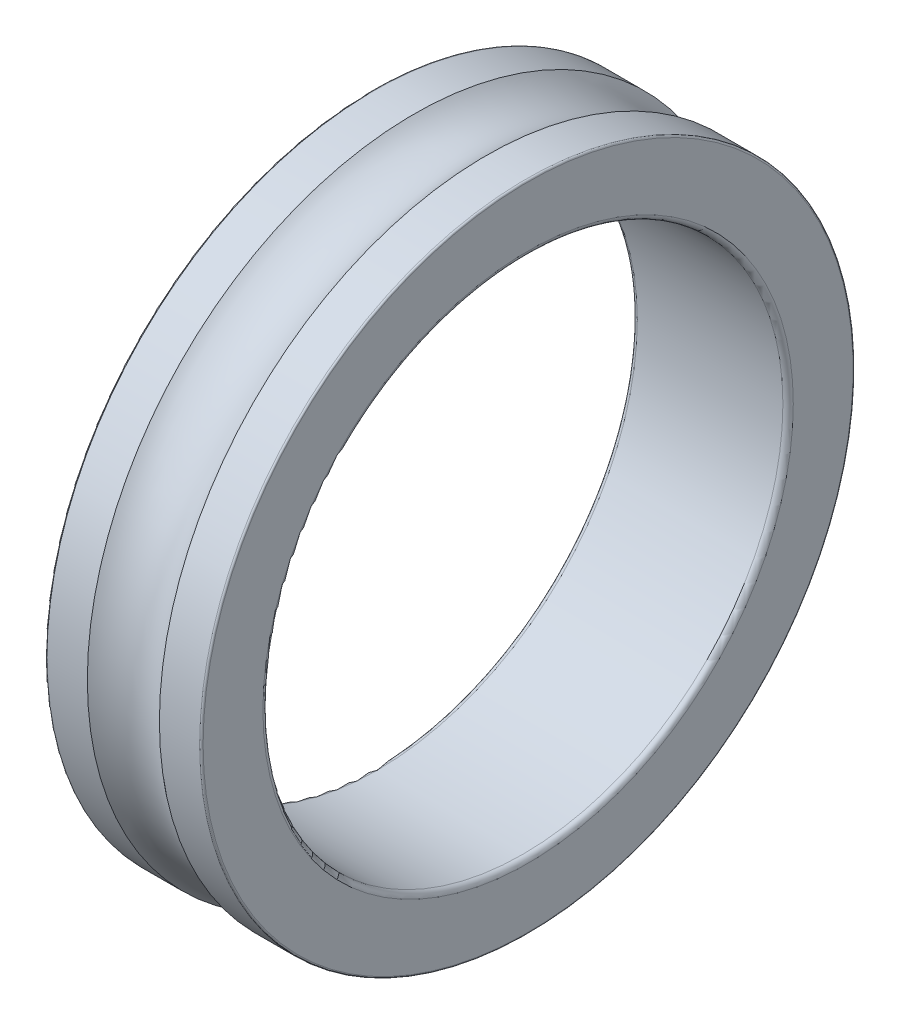
ISO-10303-21;
HEADER;
FILE_DESCRIPTION(('STEP AP214'),'2;1');
FILE_NAME('part.step','',(''),(''),'','','');
FILE_SCHEMA(('AUTOMOTIVE_DESIGN { 1 0 10303 214 1 1 1 1 }'));
ENDSEC;
DATA;
#1=APPLICATION_CONTEXT('core data for automotive mechanical design processes');
#2=APPLICATION_PROTOCOL_DEFINITION('international standard','automotive_design',2000,#1);
#3=PRODUCT_CONTEXT('',#1,'mechanical');
#4=PRODUCT('Part','Part','',(#3));
#5=PRODUCT_RELATED_PRODUCT_CATEGORY('part','',(#4));
#6=PRODUCT_DEFINITION_FORMATION('','',#4);
#7=PRODUCT_DEFINITION_CONTEXT('part definition',#1,'design');
#8=PRODUCT_DEFINITION('design','',#6,#7);
#9=PRODUCT_DEFINITION_SHAPE('','',#8);
#10=(LENGTH_UNIT() NAMED_UNIT(*) SI_UNIT(.MILLI.,.METRE.));
#11=(NAMED_UNIT(*) PLANE_ANGLE_UNIT() SI_UNIT($,.RADIAN.));
#12=(NAMED_UNIT(*) SI_UNIT($,.STERADIAN.) SOLID_ANGLE_UNIT());
#13=UNCERTAINTY_MEASURE_WITH_UNIT(LENGTH_MEASURE(1.E-05),#10,'distance_accuracy_value','');
#14=(GEOMETRIC_REPRESENTATION_CONTEXT(3) GLOBAL_UNCERTAINTY_ASSIGNED_CONTEXT((#13)) GLOBAL_UNIT_ASSIGNED_CONTEXT((#10,
#11,#12)) REPRESENTATION_CONTEXT('',''));
#15=CARTESIAN_POINT('',(0.,0.,0.));
#16=DIRECTION('',(0.,0.,1.));
#17=DIRECTION('',(1.,0.,0.));
#18=AXIS2_PLACEMENT_3D('',#15,#16,#17);
#19=CARTESIAN_POINT('',(0.,-19.0983064341402,-18.75));
#20=DIRECTION('',(-1.,0.,0.));
#21=DIRECTION('',(0.,0.,1.));
#22=AXIS2_PLACEMENT_3D('',#19,#20,#21);
#23=PLANE('',#22);
#24=CARTESIAN_POINT('',(0.,0.,0.));
#25=DIRECTION('',(-1.,0.,0.));
#26=DIRECTION('',(0.,0.,-1.));
#27=AXIS2_PLACEMENT_3D('',#24,#25,#26);
#28=CIRCLE('',#27,18.7500000129054);
#29=CARTESIAN_POINT('',(0.,0.,-18.7500000129054));
#30=VERTEX_POINT('',#29);
#31=EDGE_CURVE('E50',#30,#30,#28,.F.);
#32=ORIENTED_EDGE('',*,*,#31,.F.);
#33=EDGE_LOOP('',(#32));
#34=FACE_BOUND('',#33,.T.);
#35=CARTESIAN_POINT('',(0.,0.,0.));
#36=DIRECTION('',(1.,0.,0.));
#37=DIRECTION('',(0.,-1.16849681709782E-09,1.));
#38=AXIS2_PLACEMENT_3D('',#35,#36,#37);
#39=CIRCLE('',#38,15.3);
#40=CARTESIAN_POINT('',(0.,-1.78780013015967E-08,15.3));
#41=VERTEX_POINT('',#40);
#42=EDGE_CURVE('E47',#41,#41,#39,.T.);
#43=ORIENTED_EDGE('',*,*,#42,.T.);
#44=EDGE_LOOP('',(#43));
#45=FACE_BOUND('',#44,.T.);
#46=ADVANCED_FACE('F15',(#34,#45),#23,.T.);
#47=CARTESIAN_POINT('',(9.,-19.0983064451772,18.75));
#48=DIRECTION('',(1.,0.,0.));
#49=DIRECTION('',(0.,0.,-1.));
#50=AXIS2_PLACEMENT_3D('',#47,#48,#49);
#51=PLANE('',#50);
#52=CARTESIAN_POINT('',(9.,0.,0.));
#53=DIRECTION('',(1.,0.,0.));
#54=DIRECTION('',(0.,0.,1.));
#55=AXIS2_PLACEMENT_3D('',#52,#53,#54);
#56=CIRCLE('',#55,18.7500000165268);
#57=CARTESIAN_POINT('',(9.,0.,18.7500000165268));
#58=VERTEX_POINT('',#57);
#59=EDGE_CURVE('E44',#58,#58,#56,.T.);
#60=ORIENTED_EDGE('',*,*,#59,.T.);
#61=EDGE_LOOP('',(#60));
#62=FACE_BOUND('',#61,.T.);
#63=CARTESIAN_POINT('',(9.,0.,0.));
#64=DIRECTION('',(-1.,0.,0.));
#65=DIRECTION('',(0.,0.,-1.));
#66=AXIS2_PLACEMENT_3D('',#63,#64,#65);
#67=CIRCLE('',#66,15.3000000077429);
#68=CARTESIAN_POINT('',(9.,0.,-15.3000000077429));
#69=VERTEX_POINT('',#68);
#70=EDGE_CURVE('E41',#69,#69,#67,.F.);
#71=ORIENTED_EDGE('',*,*,#70,.F.);
#72=EDGE_LOOP('',(#71));
#73=FACE_BOUND('',#72,.T.);
#74=ADVANCED_FACE('F58',(#62,#73),#51,.T.);
#75=CARTESIAN_POINT('',(0.29999999999994,0.,0.));
#76=DIRECTION('',(1.,0.,0.));
#77=DIRECTION('',(0.,0.,1.));
#78=AXIS2_PLACEMENT_3D('',#75,#76,#77);
#79=TOROIDAL_SURFACE('',#78,15.3,0.29999999999994);
#80=CARTESIAN_POINT('',(0.299999999999994,0.,0.));
#81=DIRECTION('',(1.,0.,0.));
#82=DIRECTION('',(0.,0.,1.));
#83=AXIS2_PLACEMENT_3D('',#80,#81,#82);
#84=CIRCLE('',#83,15.0000000000001);
#85=CARTESIAN_POINT('',(0.299999999999994,0.,15.0000000000001));
#86=VERTEX_POINT('',#85);
#87=EDGE_CURVE('E38',#86,#86,#84,.T.);
#88=ORIENTED_EDGE('',*,*,#87,.T.);
#89=EDGE_LOOP('',(#88));
#90=FACE_BOUND('',#89,.T.);
#91=ORIENTED_EDGE('',*,*,#42,.F.);
#92=EDGE_LOOP('',(#91));
#93=FACE_BOUND('',#92,.T.);
#94=ADVANCED_FACE('F62',(#90,#93),#79,.T.);
#95=CARTESIAN_POINT('',(100.,0.,0.));
#96=DIRECTION('',(1.,0.,0.));
#97=DIRECTION('',(0.,0.,1.));
#98=AXIS2_PLACEMENT_3D('',#95,#96,#97);
#99=CYLINDRICAL_SURFACE('',#98,15.);
#100=CARTESIAN_POINT('',(8.7,0.,0.));
#101=DIRECTION('',(1.,0.,0.));
#102=DIRECTION('',(0.,-1.9234201974874E-10,1.));
#103=AXIS2_PLACEMENT_3D('',#100,#101,#102);
#104=CIRCLE('',#103,15.);
#105=CARTESIAN_POINT('',(8.7,-2.8851302962311E-09,15.));
#106=VERTEX_POINT('',#105);
#107=EDGE_CURVE('E35',#106,#106,#104,.T.);
#108=ORIENTED_EDGE('',*,*,#107,.T.);
#109=EDGE_LOOP('',(#108));
#110=FACE_BOUND('',#109,.T.);
#111=ORIENTED_EDGE('',*,*,#87,.F.);
#112=EDGE_LOOP('',(#111));
#113=FACE_BOUND('',#112,.T.);
#114=ADVANCED_FACE('F64',(#110,#113),#99,.F.);
#115=CARTESIAN_POINT('',(8.70000000000012,0.,0.));
#116=DIRECTION('',(1.,0.,0.));
#117=DIRECTION('',(0.,1.16849786547399E-09,1.));
#118=AXIS2_PLACEMENT_3D('',#115,#116,#117);
#119=TOROIDAL_SURFACE('',#118,15.3,0.29999999999988);
#120=ORIENTED_EDGE('',*,*,#70,.T.);
#121=EDGE_LOOP('',(#120));
#122=FACE_BOUND('',#121,.T.);
#123=ORIENTED_EDGE('',*,*,#107,.F.);
#124=EDGE_LOOP('',(#123));
#125=FACE_BOUND('',#124,.T.);
#126=ADVANCED_FACE('F72',(#122,#125),#119,.T.);
#127=CARTESIAN_POINT('',(8.90000000000066,0.,0.));
#128=DIRECTION('',(1.,0.,0.));
#129=DIRECTION('',(0.,0.,1.));
#130=AXIS2_PLACEMENT_3D('',#127,#128,#129);
#131=TOROIDAL_SURFACE('',#130,18.7500000000007,0.0999999999993402);
#132=CARTESIAN_POINT('',(8.90000000000066,0.,0.));
#133=DIRECTION('',(1.,0.,0.));
#134=DIRECTION('',(0.,0.,1.));
#135=AXIS2_PLACEMENT_3D('',#132,#133,#134);
#136=CIRCLE('',#135,18.85);
#137=CARTESIAN_POINT('',(8.90000000000066,0.,18.85));
#138=VERTEX_POINT('',#137);
#139=EDGE_CURVE('E30',#138,#138,#136,.T.);
#140=ORIENTED_EDGE('',*,*,#139,.T.);
#141=EDGE_LOOP('',(#140));
#142=FACE_BOUND('',#141,.T.);
#143=ORIENTED_EDGE('',*,*,#59,.F.);
#144=EDGE_LOOP('',(#143));
#145=FACE_BOUND('',#144,.T.);
#146=ADVANCED_FACE('F80',(#142,#145),#131,.T.);
#147=CARTESIAN_POINT('',(100.,0.,0.));
#148=DIRECTION('',(1.,0.,0.));
#149=DIRECTION('',(0.,0.,1.));
#150=AXIS2_PLACEMENT_3D('',#147,#148,#149);
#151=CYLINDRICAL_SURFACE('',#150,18.85);
#152=CARTESIAN_POINT('',(6.57861131527758,0.,0.));
#153=DIRECTION('',(1.,0.,0.));
#154=DIRECTION('',(0.,0.,1.));
#155=AXIS2_PLACEMENT_3D('',#152,#153,#154);
#156=CIRCLE('',#155,18.85);
#157=CARTESIAN_POINT('',(6.57861131527758,0.,18.85));
#158=VERTEX_POINT('',#157);
#159=EDGE_CURVE('E26',#158,#158,#156,.T.);
#160=ORIENTED_EDGE('',*,*,#159,.T.);
#161=EDGE_LOOP('',(#160));
#162=FACE_BOUND('',#161,.T.);
#163=ORIENTED_EDGE('',*,*,#139,.F.);
#164=EDGE_LOOP('',(#163));
#165=FACE_BOUND('',#164,.T.);
#166=ADVANCED_FACE('F84',(#162,#165),#151,.T.);
#167=CARTESIAN_POINT('',(4.5,0.,0.));
#168=DIRECTION('',(1.,0.,0.));
#169=DIRECTION('',(0.,0.,1.));
#170=AXIS2_PLACEMENT_3D('',#167,#168,#169);
#171=TOROIDAL_SURFACE('',#170,21.25,3.17500000000005);
#172=ORIENTED_EDGE('',*,*,#159,.F.);
#173=EDGE_LOOP('',(#172));
#174=FACE_BOUND('',#173,.T.);
#175=CARTESIAN_POINT('',(2.42138868472238,0.,0.));
#176=DIRECTION('',(1.,0.,0.));
#177=DIRECTION('',(0.,0.,1.));
#178=AXIS2_PLACEMENT_3D('',#175,#176,#177);
#179=CIRCLE('',#178,18.85);
#180=CARTESIAN_POINT('',(2.42138868472238,0.,18.85));
#181=VERTEX_POINT('',#180);
#182=EDGE_CURVE('E22',#181,#181,#179,.T.);
#183=ORIENTED_EDGE('',*,*,#182,.T.);
#184=EDGE_LOOP('',(#183));
#185=FACE_BOUND('',#184,.T.);
#186=ADVANCED_FACE('F88',(#174,#185),#171,.F.);
#187=CARTESIAN_POINT('',(100.,0.,0.));
#188=DIRECTION('',(1.,0.,0.));
#189=DIRECTION('',(0.,0.,1.));
#190=AXIS2_PLACEMENT_3D('',#187,#188,#189);
#191=CYLINDRICAL_SURFACE('',#190,18.85);
#192=CARTESIAN_POINT('',(0.100000000000009,0.,0.));
#193=DIRECTION('',(1.,0.,0.));
#194=DIRECTION('',(0.,0.,1.));
#195=AXIS2_PLACEMENT_3D('',#192,#193,#194);
#196=CIRCLE('',#195,18.85);
#197=CARTESIAN_POINT('',(0.100000000000009,0.,18.85));
#198=VERTEX_POINT('',#197);
#199=EDGE_CURVE('E10',#198,#198,#196,.T.);
#200=ORIENTED_EDGE('',*,*,#199,.T.);
#201=EDGE_LOOP('',(#200));
#202=FACE_BOUND('',#201,.T.);
#203=ORIENTED_EDGE('',*,*,#182,.F.);
#204=EDGE_LOOP('',(#203));
#205=FACE_BOUND('',#204,.T.);
#206=ADVANCED_FACE('F91',(#202,#205),#191,.T.);
#207=CARTESIAN_POINT('',(0.0999999999994148,0.,0.));
#208=DIRECTION('',(1.,0.,0.));
#209=DIRECTION('',(0.,1.16863420086142E-09,1.));
#210=AXIS2_PLACEMENT_3D('',#207,#208,#209);
#211=TOROIDAL_SURFACE('',#210,18.7500000000006,0.0999999999994165);
#212=ORIENTED_EDGE('',*,*,#31,.T.);
#213=EDGE_LOOP('',(#212));
#214=FACE_BOUND('',#213,.T.);
#215=ORIENTED_EDGE('',*,*,#199,.F.);
#216=EDGE_LOOP('',(#215));
#217=FACE_BOUND('',#216,.T.);
#218=ADVANCED_FACE('F17',(#214,#217),#211,.T.);
#219=CLOSED_SHELL('',(#46,#74,#94,#114,#126,#146,#166,#186,#206,#218));
#220=MANIFOLD_SOLID_BREP('B1',#219);
#221=ADVANCED_BREP_SHAPE_REPRESENTATION('',(#18,#220),#14);
#222=SHAPE_DEFINITION_REPRESENTATION(#9,#221);
ENDSEC;
END-ISO-10303-21;
